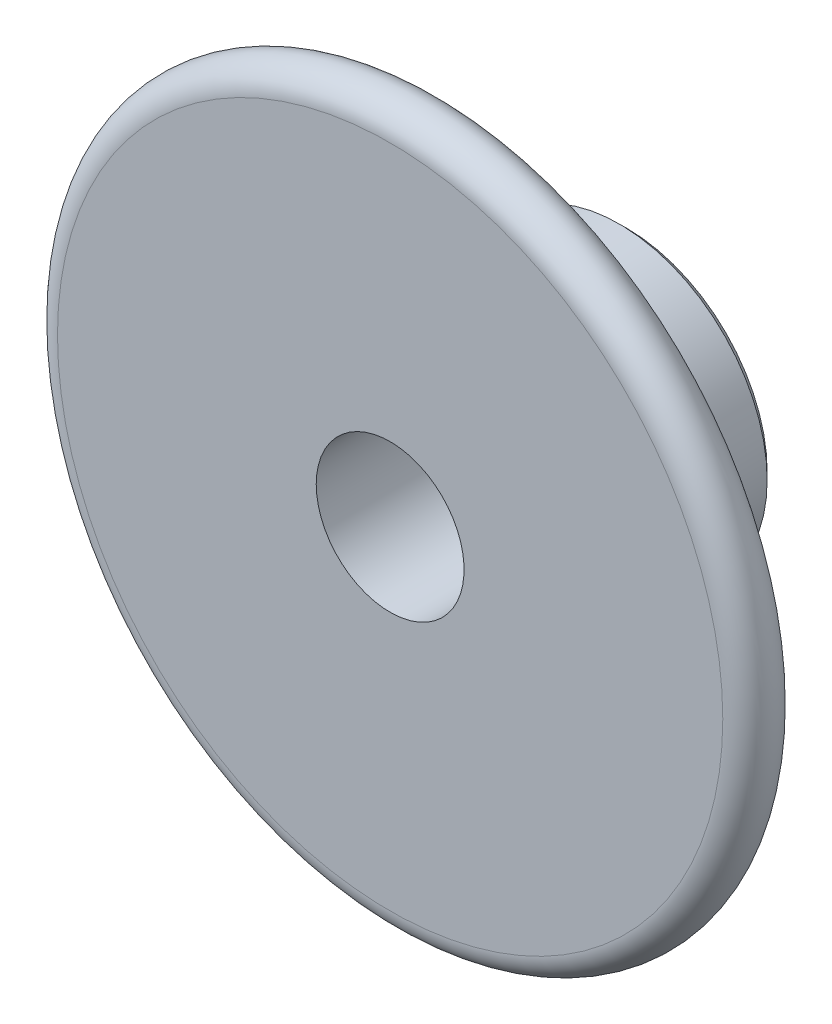
ISO-10303-21;
HEADER;
FILE_DESCRIPTION(('STEP AP214'),'2;1');
FILE_NAME('part.step','',(''),(''),'','','');
FILE_SCHEMA(('AUTOMOTIVE_DESIGN { 1 0 10303 214 1 1 1 1 }'));
ENDSEC;
DATA;
#1=APPLICATION_CONTEXT('core data for automotive mechanical design processes');
#2=APPLICATION_PROTOCOL_DEFINITION('international standard','automotive_design',2000,#1);
#3=PRODUCT_CONTEXT('',#1,'mechanical');
#4=PRODUCT('Part','Part','',(#3));
#5=PRODUCT_RELATED_PRODUCT_CATEGORY('part','',(#4));
#6=PRODUCT_DEFINITION_FORMATION('','',#4);
#7=PRODUCT_DEFINITION_CONTEXT('part definition',#1,'design');
#8=PRODUCT_DEFINITION('design','',#6,#7);
#9=PRODUCT_DEFINITION_SHAPE('','',#8);
#10=(LENGTH_UNIT() NAMED_UNIT(*) SI_UNIT(.MILLI.,.METRE.));
#11=(NAMED_UNIT(*) PLANE_ANGLE_UNIT() SI_UNIT($,.RADIAN.));
#12=(NAMED_UNIT(*) SI_UNIT($,.STERADIAN.) SOLID_ANGLE_UNIT());
#13=UNCERTAINTY_MEASURE_WITH_UNIT(LENGTH_MEASURE(1.E-05),#10,'distance_accuracy_value','');
#14=(GEOMETRIC_REPRESENTATION_CONTEXT(3) GLOBAL_UNCERTAINTY_ASSIGNED_CONTEXT((#13)) GLOBAL_UNIT_ASSIGNED_CONTEXT((#10,
#11,#12)) REPRESENTATION_CONTEXT('',''));
#15=CARTESIAN_POINT('',(0.,0.,0.));
#16=DIRECTION('',(0.,0.,1.));
#17=DIRECTION('',(1.,0.,0.));
#18=AXIS2_PLACEMENT_3D('',#15,#16,#17);
#19=CARTESIAN_POINT('',(0.,0.,12.5));
#20=DIRECTION('',(0.,0.,-1.));
#21=DIRECTION('',(-1.,0.,0.));
#22=AXIS2_PLACEMENT_3D('',#19,#20,#21);
#23=CYLINDRICAL_SURFACE('',#22,10.);
#24=CARTESIAN_POINT('',(10.,0.,7.64999999999999));
#25=CARTESIAN_POINT('',(9.99999843258099,0.092011453105751,7.64999629901469));
#26=CARTESIAN_POINT('',(9.99871684765511,0.184073454347172,7.64227754131457));
#27=CARTESIAN_POINT('',(9.99372775496381,0.365616322535328,7.61161876486206));
#28=CARTESIAN_POINT('',(9.9900180027216,0.455094721351767,7.58866466304119));
#29=CARTESIAN_POINT('',(9.98058875631552,0.628817487751612,7.52824636106408));
#30=CARTESIAN_POINT('',(9.974870893487,0.713066038744482,7.49079393643969));
#31=CARTESIAN_POINT('',(9.96205444853338,0.874072236504038,7.40247274585137));
#32=CARTESIAN_POINT('',(9.95495602786423,0.950830757653324,7.35160554849499));
#33=CARTESIAN_POINT('',(9.9400912001718,1.09540879372212,7.23739122286707));
#34=CARTESIAN_POINT('',(9.93231968689365,1.16314787882339,7.17394293638174));
#35=CARTESIAN_POINT('',(9.9170237472334,1.28706950777735,7.03658522640677));
#36=CARTESIAN_POINT('',(9.90949933632427,1.34325132909588,6.96267514935681));
#37=CARTESIAN_POINT('',(9.89550007731641,1.44278500045253,6.80594065632332));
#38=CARTESIAN_POINT('',(9.88903182722124,1.48605749570898,6.72306520565612));
#39=CARTESIAN_POINT('',(9.87794796970923,1.55803674048924,6.5510973747635));
#40=CARTESIAN_POINT('',(9.8733322397089,1.58674445381555,6.46200540635072));
#41=CARTESIAN_POINT('',(9.86652679242373,1.62852619503009,6.28098541799901));
#42=CARTESIAN_POINT('',(9.86431555933323,1.6417389592795,6.18909024432124));
#43=CARTESIAN_POINT('',(9.86250435770823,1.65258585530686,6.00436263407657));
#44=CARTESIAN_POINT('',(9.86290420804218,1.65022106770359,5.91153026296937));
#45=CARTESIAN_POINT('',(9.86625034802632,1.63009303176277,5.72855272294329));
#46=CARTESIAN_POINT('',(9.86917088684506,1.61248549472487,5.63838988597263));
#47=CARTESIAN_POINT('',(9.87718903199043,1.56261607367809,5.46231592946661));
#48=CARTESIAN_POINT('',(9.88228671162733,1.53035369619837,5.37640495321172));
#49=CARTESIAN_POINT('',(9.89411264039674,1.45193210975571,5.21080647007559));
#50=CARTESIAN_POINT('',(9.90084846298694,1.4057081060585,5.13115021075932));
#51=CARTESIAN_POINT('',(9.9151864393107,1.30072141548377,4.98066567609225));
#52=CARTESIAN_POINT('',(9.92278866158316,1.24195773629986,4.90983810008772));
#53=CARTESIAN_POINT('',(9.93811607123993,1.11271072676602,4.77812002111733));
#54=CARTESIAN_POINT('',(9.94584163094155,1.04209376928222,4.71736060537005));
#55=CARTESIAN_POINT('',(9.96045987838133,0.891597059898562,4.60853397839374));
#56=CARTESIAN_POINT('',(9.9673525609492,0.811717250503354,4.56046684595291));
#57=CARTESIAN_POINT('',(9.97953794169528,0.64484008317075,4.47837784946569));
#58=CARTESIAN_POINT('',(9.98482933722619,0.557837003156557,4.44436741236199));
#59=CARTESIAN_POINT('',(9.99320544362233,0.379246930002469,4.39147808722467));
#60=CARTESIAN_POINT('',(9.99629033536768,0.28766031326082,4.37259795885522));
#61=CARTESIAN_POINT('',(9.99988156603306,0.103632983819161,4.35068253883884));
#62=CARTESIAN_POINT('',(10.0004171933872,0.0112142564118358,4.34746726387847));
#63=CARTESIAN_POINT('',(9.99892971175882,-0.17284150555468,4.35649319868027));
#64=CARTESIAN_POINT('',(9.99690669920295,-0.264478569441162,4.36873382596048));
#65=CARTESIAN_POINT('',(9.99054737820398,-0.443814955541767,4.40817440277711));
#66=CARTESIAN_POINT('',(9.98622483070292,-0.531534371938299,4.43528539430836));
#67=CARTESIAN_POINT('',(9.97574921956607,-0.701182959294589,4.50360239255508));
#68=CARTESIAN_POINT('',(9.96959605484327,-0.783111810188986,4.54480917766169));
#69=CARTESIAN_POINT('',(9.95606928426946,-0.939636398877247,4.64056131949899));
#70=CARTESIAN_POINT('',(9.94868555427359,-1.01416235726447,4.6952192859171));
#71=CARTESIAN_POINT('',(9.93354765732487,-1.15304841333208,4.81616714906879));
#72=CARTESIAN_POINT('',(9.92579346406182,-1.21740778758215,4.8824578728543));
#73=CARTESIAN_POINT('',(9.91069407401676,-1.33479962911471,5.0255961063283));
#74=CARTESIAN_POINT('',(9.90335382329476,-1.38771058951943,5.10254387109881));
#75=CARTESIAN_POINT('',(9.89000528724129,-1.47985547415616,5.26434104706747));
#76=CARTESIAN_POINT('',(9.88399696030451,-1.51908982562646,5.34919021133191));
#77=CARTESIAN_POINT('',(9.87402953570153,-1.58258535747086,5.52403953240315));
#78=CARTESIAN_POINT('',(9.87006212213643,-1.60690737863648,5.61401709979667));
#79=CARTESIAN_POINT('',(9.86460473721113,-1.64007952798875,5.79685131178056));
#80=CARTESIAN_POINT('',(9.86311455516768,-1.64893097191818,5.88970771084816));
#81=CARTESIAN_POINT('',(9.86278931217107,-1.65087457438795,6.07445064130181));
#82=CARTESIAN_POINT('',(9.86392203182987,-1.64415796786953,6.16633516019211));
#83=CARTESIAN_POINT('',(9.86864441177183,-1.61556925478546,6.34764775186387));
#84=CARTESIAN_POINT('',(9.87223406454433,-1.59369719454886,6.43707583215359));
#85=CARTESIAN_POINT('',(9.88145370519206,-1.53549112071356,6.61086524243541));
#86=CARTESIAN_POINT('',(9.88708141498759,-1.49917324977365,6.69523210745096));
#87=CARTESIAN_POINT('',(9.89974533231771,-1.41312606218934,6.85670626686032));
#88=CARTESIAN_POINT('',(9.90678160742252,-1.3633961021142,6.93381321272772));
#89=CARTESIAN_POINT('',(9.92157214136343,-1.25125259966706,7.07954549763769));
#90=CARTESIAN_POINT('',(9.92933379899765,-1.18869826623126,7.14806175981956));
#91=CARTESIAN_POINT('',(9.94464125601211,-1.05297867490409,7.27369059987675));
#92=CARTESIAN_POINT('',(9.95218700513286,-0.979810970092667,7.33080054078023));
#93=CARTESIAN_POINT('',(9.96627143049842,-0.824354696103043,7.43234742257348));
#94=CARTESIAN_POINT('',(9.97280295936929,-0.742007852048184,7.47669614797802));
#95=CARTESIAN_POINT('',(9.98405342047581,-0.570959586923793,7.5508633528063));
#96=CARTESIAN_POINT('',(9.98877416450827,-0.482264623543762,7.58069636412524));
#97=CARTESIAN_POINT('',(9.99483601455804,-0.327682758240928,7.61847934152684));
#98=CARTESIAN_POINT('',(9.99676220083327,-0.2627330667111,7.63028074881449));
#99=CARTESIAN_POINT('',(9.99934474465587,-0.131864227625941,7.6460423389331));
#100=CARTESIAN_POINT('',(10.0000011233775,-0.0659450962546688,7.65000265251578));
#101=CARTESIAN_POINT('',(10.,0.,7.64999999999999));
#102=B_SPLINE_CURVE_WITH_KNOTS('',3,(#24,#25,#26,#27,#28,#29,#30,#31,#32,#33,#34,#35,#36,#37,
#38,#39,#40,#41,#42,#43,#44,#45,#46,#47,#48,#49,#50,#51,#52,#53,#54,#55,#56,#57,#58,#59,#60,#61,
#62,#63,#64,#65,#66,#67,#68,#69,#70,#71,#72,#73,#74,#75,#76,#77,#78,#79,#80,#81,#82,#83,#84,#85,
#86,#87,#88,#89,#90,#91,#92,#93,#94,#95,#96,#97,#98,#99,#100,#101),.UNSPECIFIED.,.T.,.F.,(4,2,2,
2,2,2,2,2,2,2,2,2,2,2,2,2,2,2,2,2,2,2,2,2,2,2,2,2,2,2,2,2,2,2,2,2,2,2,4),(0.,0.275793319008917,
0.551841928312971,0.827666799870595,1.1034594331417,1.38156673144315,1.65969141110741,
1.93949209608633,2.21927426326044,2.49653175525205,2.77377001402269,3.04820914252876,
3.32265751287871,3.59839967320041,3.87416366201706,4.1532757240192,4.43238951858747,
4.71172976565331,4.991047110928,5.26714751096616,5.54323750600188,5.81769359979003,
6.09216485190802,6.36901711215384,6.64588906369256,6.92556925596458,7.20524071063226,
7.48376340648031,7.76226241335695,8.03735855216243,8.312453850024,8.58724259883657,
8.86204453269315,9.14004258759616,9.4181048373113,9.69804546871316,9.97770526783279,
10.1753710978727,10.3730336317698),.UNSPECIFIED.);
#103=CARTESIAN_POINT('',(10.,0.,7.64999999999999));
#104=VERTEX_POINT('',#103);
#105=EDGE_CURVE('E96',#104,#104,#102,.T.);
#106=ORIENTED_EDGE('',*,*,#105,.T.);
#107=EDGE_LOOP('',(#106));
#108=FACE_BOUND('',#107,.T.);
#109=CARTESIAN_POINT('',(0.,0.,0.499999999999994));
#110=DIRECTION('',(0.,0.,1.));
#111=DIRECTION('',(1.,0.,0.));
#112=AXIS2_PLACEMENT_3D('',#109,#110,#111);
#113=CIRCLE('',#112,10.);
#114=CARTESIAN_POINT('',(10.,0.,0.499999999999994));
#115=VERTEX_POINT('',#114);
#116=EDGE_CURVE('E10',#115,#115,#113,.T.);
#117=ORIENTED_EDGE('',*,*,#116,.T.);
#118=EDGE_LOOP('',(#117));
#119=FACE_BOUND('',#118,.T.);
#120=CARTESIAN_POINT('',(0.,10.,4.35000000000001));
#121=CARTESIAN_POINT('',(0.0920114531057511,9.99999843258099,4.35000370098531));
#122=CARTESIAN_POINT('',(0.184073454347172,9.99871684765511,4.35772245868543));
#123=CARTESIAN_POINT('',(0.365616322535328,9.99372775496381,4.38838123513794));
#124=CARTESIAN_POINT('',(0.455094721351767,9.9900180027216,4.41133533695881));
#125=CARTESIAN_POINT('',(0.628817487751613,9.98058875631552,4.47175363893592));
#126=CARTESIAN_POINT('',(0.713066038744483,9.974870893487,4.50920606356031));
#127=CARTESIAN_POINT('',(0.874072236504039,9.96205444853338,4.59752725414863));
#128=CARTESIAN_POINT('',(0.950830757653325,9.95495602786423,4.64839445150501));
#129=CARTESIAN_POINT('',(1.09540879372212,9.9400912001718,4.76260877713293));
#130=CARTESIAN_POINT('',(1.16314787882339,9.93231968689365,4.82605706361826));
#131=CARTESIAN_POINT('',(1.28706950777735,9.9170237472334,4.96341477359323));
#132=CARTESIAN_POINT('',(1.34325132909588,9.90949933632427,5.03732485064319));
#133=CARTESIAN_POINT('',(1.44278500045253,9.89550007731641,5.19405934367668));
#134=CARTESIAN_POINT('',(1.48605749570898,9.88903182722124,5.27693479434388));
#135=CARTESIAN_POINT('',(1.55803674048924,9.87794796970923,5.4489026252365));
#136=CARTESIAN_POINT('',(1.58674445381555,9.8733322397089,5.53799459364928));
#137=CARTESIAN_POINT('',(1.62852619503009,9.86652679242373,5.71901458200099));
#138=CARTESIAN_POINT('',(1.6417389592795,9.86431555933323,5.81090975567876));
#139=CARTESIAN_POINT('',(1.65258585530686,9.86250435770823,5.99563736592343));
#140=CARTESIAN_POINT('',(1.65022106770359,9.86290420804218,6.08846973703063));
#141=CARTESIAN_POINT('',(1.63009303176277,9.86625034802632,6.27144727705671));
#142=CARTESIAN_POINT('',(1.61248549472487,9.86917088684506,6.36161011402737));
#143=CARTESIAN_POINT('',(1.56261607367809,9.87718903199043,6.5376840705334));
#144=CARTESIAN_POINT('',(1.53035369619837,9.88228671162733,6.62359504678828));
#145=CARTESIAN_POINT('',(1.45193210975571,9.89411264039674,6.78919352992442));
#146=CARTESIAN_POINT('',(1.40570810605849,9.90084846298694,6.86884978924068));
#147=CARTESIAN_POINT('',(1.30072141548377,9.9151864393107,7.01933432390775));
#148=CARTESIAN_POINT('',(1.24195773629986,9.92278866158316,7.09016189991229));
#149=CARTESIAN_POINT('',(1.11271072676602,9.93811607123993,7.22187997888267));
#150=CARTESIAN_POINT('',(1.04209376928222,9.94584163094155,7.28263939462995));
#151=CARTESIAN_POINT('',(0.891597059898561,9.96045987838133,7.39146602160626));
#152=CARTESIAN_POINT('',(0.811717250503353,9.9673525609492,7.43953315404709));
#153=CARTESIAN_POINT('',(0.64484008317075,9.97953794169528,7.52162215053431));
#154=CARTESIAN_POINT('',(0.557837003156556,9.98482933722619,7.55563258763801));
#155=CARTESIAN_POINT('',(0.379246930002468,9.99320544362233,7.60852191277533));
#156=CARTESIAN_POINT('',(0.28766031326082,9.99629033536768,7.62740204114478));
#157=CARTESIAN_POINT('',(0.10363298381916,9.99988156603306,7.64931746116117));
#158=CARTESIAN_POINT('',(0.0112142564118353,10.0004171933872,7.65253273612153));
#159=CARTESIAN_POINT('',(-0.172841505554681,9.99892971175882,7.64350680131973));
#160=CARTESIAN_POINT('',(-0.264478569441163,9.99690669920295,7.63126617403952));
#161=CARTESIAN_POINT('',(-0.443814955541768,9.99054737820398,7.59182559722289));
#162=CARTESIAN_POINT('',(-0.5315343719383,9.98622483070291,7.56471460569164));
#163=CARTESIAN_POINT('',(-0.70118295929459,9.97574921956607,7.49639760744492));
#164=CARTESIAN_POINT('',(-0.783111810188987,9.96959605484327,7.45519082233831));
#165=CARTESIAN_POINT('',(-0.939636398877248,9.95606928426946,7.35943868050101));
#166=CARTESIAN_POINT('',(-1.01416235726447,9.94868555427359,7.3047807140829));
#167=CARTESIAN_POINT('',(-1.15304841333208,9.93354765732487,7.18383285093121));
#168=CARTESIAN_POINT('',(-1.21740778758215,9.92579346406183,7.1175421271457));
#169=CARTESIAN_POINT('',(-1.33479962911471,9.91069407401676,6.9744038936717));
#170=CARTESIAN_POINT('',(-1.38771058951943,9.90335382329476,6.89745612890119));
#171=CARTESIAN_POINT('',(-1.47985547415616,9.89000528724129,6.73565895293253));
#172=CARTESIAN_POINT('',(-1.51908982562647,9.88399696030451,6.65080978866809));
#173=CARTESIAN_POINT('',(-1.58258535747086,9.87402953570153,6.47596046759685));
#174=CARTESIAN_POINT('',(-1.60690737863648,9.87006212213643,6.38598290020333));
#175=CARTESIAN_POINT('',(-1.64007952798875,9.86460473721113,6.20314868821944));
#176=CARTESIAN_POINT('',(-1.64893097191818,9.86311455516768,6.11029228915184));
#177=CARTESIAN_POINT('',(-1.65087457438795,9.86278931217107,5.92554935869819));
#178=CARTESIAN_POINT('',(-1.64415796786953,9.86392203182987,5.83366483980789));
#179=CARTESIAN_POINT('',(-1.61556925478546,9.86864441177183,5.65235224813613));
#180=CARTESIAN_POINT('',(-1.59369719454886,9.87223406454433,5.56292416784641));
#181=CARTESIAN_POINT('',(-1.53549112071356,9.88145370519206,5.38913475756459));
#182=CARTESIAN_POINT('',(-1.49917324977365,9.88708141498759,5.30476789254904));
#183=CARTESIAN_POINT('',(-1.41312606218934,9.89974533231771,5.14329373313968));
#184=CARTESIAN_POINT('',(-1.3633961021142,9.90678160742253,5.06618678727228));
#185=CARTESIAN_POINT('',(-1.25125259966706,9.92157214136343,4.92045450236232));
#186=CARTESIAN_POINT('',(-1.18869826623126,9.92933379899765,4.85193824018044));
#187=CARTESIAN_POINT('',(-1.05297867490409,9.94464125601211,4.72630940012325));
#188=CARTESIAN_POINT('',(-0.979810970092667,9.95218700513286,4.66919945921977));
#189=CARTESIAN_POINT('',(-0.824354696103043,9.96627143049842,4.56765257742652));
#190=CARTESIAN_POINT('',(-0.742007852048184,9.97280295936929,4.52330385202198));
#191=CARTESIAN_POINT('',(-0.570959586923793,9.98405342047581,4.4491366471937));
#192=CARTESIAN_POINT('',(-0.482264623543762,9.98877416450827,4.41930363587476));
#193=CARTESIAN_POINT('',(-0.327682758240928,9.99483601455804,4.38152065847316));
#194=CARTESIAN_POINT('',(-0.2627330667111,9.99676220083327,4.36971925118551));
#195=CARTESIAN_POINT('',(-0.131864227625941,9.99934474465587,4.3539576610669));
#196=CARTESIAN_POINT('',(-0.065945096254669,10.0000011233775,4.34999734748422));
#197=CARTESIAN_POINT('',(0.,10.,4.35000000000001));
#198=B_SPLINE_CURVE_WITH_KNOTS('',3,(#120,#121,#122,#123,#124,#125,#126,#127,#128,#129,#130,
#131,#132,#133,#134,#135,#136,#137,#138,#139,#140,#141,#142,#143,#144,#145,#146,#147,#148,#149,
#150,#151,#152,#153,#154,#155,#156,#157,#158,#159,#160,#161,#162,#163,#164,#165,#166,#167,#168,
#169,#170,#171,#172,#173,#174,#175,#176,#177,#178,#179,#180,#181,#182,#183,#184,#185,#186,#187,
#188,#189,#190,#191,#192,#193,#194,#195,#196,#197),.UNSPECIFIED.,.T.,.F.,(4,2,2,2,2,2,2,2,2,2,2,
2,2,2,2,2,2,2,2,2,2,2,2,2,2,2,2,2,2,2,2,2,2,2,2,2,2,2,4),(0.,0.275793319008918,
0.551841928312971,0.827666799870596,1.1034594331417,1.38156673144315,1.65969141110741,
1.93949209608633,2.21927426326044,2.49653175525206,2.77377001402269,3.04820914252876,
3.32265751287871,3.59839967320041,3.87416366201706,4.1532757240192,4.43238951858747,
4.71172976565331,4.991047110928,5.26714751096616,5.54323750600189,5.81769359979003,
6.09216485190802,6.36901711215385,6.64588906369256,6.92556925596458,7.20524071063227,
7.48376340648032,7.76226241335695,8.03735855216243,8.31245385002401,8.58724259883657,
8.86204453269315,9.14004258759615,9.4181048373113,9.69804546871316,9.97770526783279,
10.1753710978727,10.3730336317698),.UNSPECIFIED.);
#199=CARTESIAN_POINT('',(0.,10.,4.35000000000001));
#200=VERTEX_POINT('',#199);
#201=EDGE_CURVE('E65',#200,#200,#198,.T.);
#202=ORIENTED_EDGE('',*,*,#201,.T.);
#203=EDGE_LOOP('',(#202));
#204=FACE_BOUND('',#203,.T.);
#205=CARTESIAN_POINT('',(0.,0.,12.5));
#206=DIRECTION('',(0.,0.,1.));
#207=DIRECTION('',(1.,0.,0.));
#208=AXIS2_PLACEMENT_3D('',#205,#206,#207);
#209=CIRCLE('',#208,10.);
#210=CARTESIAN_POINT('',(10.,0.,12.5));
#211=VERTEX_POINT('',#210);
#212=EDGE_CURVE('E57',#211,#211,#209,.T.);
#213=ORIENTED_EDGE('',*,*,#212,.F.);
#214=EDGE_LOOP('',(#213));
#215=FACE_BOUND('',#214,.T.);
#216=ADVANCED_FACE('F32',(#108,#119,#204,#215),#23,.T.);
#217=CARTESIAN_POINT('',(0.,0.,0.));
#218=DIRECTION('',(0.,0.,1.));
#219=DIRECTION('',(1.,0.,0.));
#220=AXIS2_PLACEMENT_3D('',#217,#218,#219);
#221=PLANE('',#220);
#222=CARTESIAN_POINT('',(0.,0.,0.));
#223=DIRECTION('',(0.,0.,1.));
#224=DIRECTION('',(1.,0.,0.));
#225=AXIS2_PLACEMENT_3D('',#222,#223,#224);
#226=CIRCLE('',#225,5.5);
#227=CARTESIAN_POINT('',(5.5,0.,0.));
#228=VERTEX_POINT('',#227);
#229=EDGE_CURVE('E45',#228,#228,#226,.T.);
#230=ORIENTED_EDGE('',*,*,#229,.T.);
#231=EDGE_LOOP('',(#230));
#232=FACE_BOUND('',#231,.T.);
#233=CARTESIAN_POINT('',(0.,0.,0.));
#234=DIRECTION('',(0.,0.,1.));
#235=DIRECTION('',(1.,0.,0.));
#236=AXIS2_PLACEMENT_3D('',#233,#234,#235);
#237=CIRCLE('',#236,9.50000000000001);
#238=CARTESIAN_POINT('',(9.50000000000001,0.,0.));
#239=VERTEX_POINT('',#238);
#240=EDGE_CURVE('E49',#239,#239,#237,.F.);
#241=ORIENTED_EDGE('',*,*,#240,.T.);
#242=EDGE_LOOP('',(#241));
#243=FACE_BOUND('',#242,.T.);
#244=ADVANCED_FACE('F92',(#232,#243),#221,.F.);
#245=CARTESIAN_POINT('',(0.,0.,12.5));
#246=DIRECTION('',(0.,0.,1.));
#247=DIRECTION('',(1.,0.,0.));
#248=AXIS2_PLACEMENT_3D('',#245,#246,#247);
#249=PLANE('',#248);
#250=CARTESIAN_POINT('',(0.,0.,12.5));
#251=DIRECTION('',(0.,0.,1.));
#252=DIRECTION('',(1.,0.,0.));
#253=AXIS2_PLACEMENT_3D('',#250,#251,#252);
#254=CIRCLE('',#253,22.5);
#255=CARTESIAN_POINT('',(22.5,0.,12.5));
#256=VERTEX_POINT('',#255);
#257=EDGE_CURVE('E120',#256,#256,#254,.T.);
#258=ORIENTED_EDGE('',*,*,#257,.F.);
#259=EDGE_LOOP('',(#258));
#260=FACE_BOUND('',#259,.T.);
#261=ORIENTED_EDGE('',*,*,#212,.T.);
#262=EDGE_LOOP('',(#261));
#263=FACE_BOUND('',#262,.T.);
#264=ADVANCED_FACE('F135',(#260,#263),#249,.F.);
#265=CARTESIAN_POINT('',(0.,0.,16.));
#266=DIRECTION('',(0.,0.,1.));
#267=DIRECTION('',(1.,0.,0.));
#268=AXIS2_PLACEMENT_3D('',#265,#266,#267);
#269=PLANE('',#268);
#270=CARTESIAN_POINT('',(0.,0.,16.));
#271=DIRECTION('',(0.,0.,-1.));
#272=DIRECTION('',(-1.,0.,0.));
#273=AXIS2_PLACEMENT_3D('',#270,#271,#272);
#274=CIRCLE('',#273,5.);
#275=CARTESIAN_POINT('',(-5.,0.,16.));
#276=VERTEX_POINT('',#275);
#277=EDGE_CURVE('E87',#276,#276,#274,.T.);
#278=ORIENTED_EDGE('',*,*,#277,.T.);
#279=EDGE_LOOP('',(#278));
#280=FACE_BOUND('',#279,.T.);
#281=CARTESIAN_POINT('',(0.,0.,16.));
#282=DIRECTION('',(0.,0.,1.));
#283=DIRECTION('',(1.,0.,0.));
#284=AXIS2_PLACEMENT_3D('',#281,#282,#283);
#285=CIRCLE('',#284,22.5);
#286=CARTESIAN_POINT('',(22.5,0.,16.));
#287=VERTEX_POINT('',#286);
#288=EDGE_CURVE('E66',#287,#287,#285,.F.);
#289=ORIENTED_EDGE('',*,*,#288,.F.);
#290=EDGE_LOOP('',(#289));
#291=FACE_BOUND('',#290,.T.);
#292=ADVANCED_FACE('F127',(#280,#291),#269,.T.);
#293=CARTESIAN_POINT('',(0.,0.,16.));
#294=DIRECTION('',(0.,0.,-1.));
#295=DIRECTION('',(-1.,0.,0.));
#296=AXIS2_PLACEMENT_3D('',#293,#294,#295);
#297=CYLINDRICAL_SURFACE('',#296,5.);
#298=CARTESIAN_POINT('',(5.,0.,7.64999999999999));
#299=CARTESIAN_POINT('',(5.00000012564882,-0.0900803323989865,7.65000024251438));
#300=CARTESIAN_POINT('',(4.99754312617873,-0.180159574077353,7.64259916251504));
#301=CARTESIAN_POINT('',(4.98798348171152,-0.357667875169256,7.61327885047236));
#302=CARTESIAN_POINT('',(4.98088026257134,-0.445096605656319,7.59135782416471));
#303=CARTESIAN_POINT('',(4.962800681432,-0.614719075952391,7.53382868761171));
#304=CARTESIAN_POINT('',(4.95183071876683,-0.696921201899963,7.49824318298596));
#305=CARTESIAN_POINT('',(4.92713947248839,-0.85419064587448,7.41449642730815));
#306=CARTESIAN_POINT('',(4.91341766335966,-0.92925659707605,7.36633277369657));
#307=CARTESIAN_POINT('',(4.88414667976015,-1.07267700256013,7.25707517692859));
#308=CARTESIAN_POINT('',(4.86855436886587,-1.140755021368,7.19562998172584));
#309=CARTESIAN_POINT('',(4.83753907804007,-1.26585047260416,7.06230048608016));
#310=CARTESIAN_POINT('',(4.8221161350793,-1.32286553369749,6.99041395330728));
#311=CARTESIAN_POINT('',(4.79271313173334,-1.42578155512387,6.83576938762055));
#312=CARTESIAN_POINT('',(4.77878574898835,-1.47132547146369,6.75276276241483));
#313=CARTESIAN_POINT('',(4.75460549483772,-1.5476895000705,6.57973436916592));
#314=CARTESIAN_POINT('',(4.74435152777497,-1.57851400356115,6.48971470264767));
#315=CARTESIAN_POINT('',(4.72913282635101,-1.62353134991423,6.30835517091874));
#316=CARTESIAN_POINT('',(4.72400412235767,-1.63824134173319,6.21715783667435));
#317=CARTESIAN_POINT('',(4.7191313464795,-1.65222861163855,6.03345638730599));
#318=CARTESIAN_POINT('',(4.71938564975367,-1.65151054662634,5.94095267493226));
#319=CARTESIAN_POINT('',(4.72510629107568,-1.63506410098718,5.76165279760769));
#320=CARTESIAN_POINT('',(4.73033928879681,-1.62000769651632,5.67478626476119));
#321=CARTESIAN_POINT('',(4.74504632523488,-1.57640708934976,5.50488909383328));
#322=CARTESIAN_POINT('',(4.75452086227438,-1.54786130181505,5.42185890773475));
#323=CARTESIAN_POINT('',(4.77681173941,-1.47764674240872,5.26045256000537));
#324=CARTESIAN_POINT('',(4.78967871947683,-1.43577693123635,5.18217114977468));
#325=CARTESIAN_POINT('',(4.81728315916032,-1.34024242388314,5.03353163769848));
#326=CARTESIAN_POINT('',(4.8320211498719,-1.28657437554157,4.96317579630595));
#327=CARTESIAN_POINT('',(4.86262798242566,-1.16572801734404,4.82860477258979));
#328=CARTESIAN_POINT('',(4.87851612594017,-1.09799945388895,4.76488712135686));
#329=CARTESIAN_POINT('',(4.9089733458653,-0.952622363558084,4.64958582176081));
#330=CARTESIAN_POINT('',(4.92354230068063,-0.874972923819717,4.59800329124502));
#331=CARTESIAN_POINT('',(4.94990429259939,-0.710918878360193,4.50804648316299));
#332=CARTESIAN_POINT('',(4.96166947936115,-0.624437715003006,4.46980310278696));
#333=CARTESIAN_POINT('',(4.98089634514734,-0.445788820584335,4.40856028039371));
#334=CARTESIAN_POINT('',(4.98835948795835,-0.353623035566633,4.38555565293588));
#335=CARTESIAN_POINT('',(4.99790001929539,-0.170434936942809,4.35631921461675));
#336=CARTESIAN_POINT('',(5.00019320840939,-0.0795310449403313,4.34941490636055));
#337=CARTESIAN_POINT('',(4.99978120399321,0.10215299707419,4.35066263269127));
#338=CARTESIAN_POINT('',(4.99707683523427,0.192933165030689,4.35881218286677));
#339=CARTESIAN_POINT('',(4.98711592890817,0.369117276094975,4.38940282618292));
#340=CARTESIAN_POINT('',(4.97999029806495,0.454600657078432,4.41143321001454));
#341=CARTESIAN_POINT('',(4.9620361021664,0.620625393385986,4.46864869151176));
#342=CARTESIAN_POINT('',(4.9512070668376,0.70116611953883,4.5038354598819));
#343=CARTESIAN_POINT('',(4.92659738190256,0.857353583850653,4.58738101955237));
#344=CARTESIAN_POINT('',(4.91274728599484,0.932818538636806,4.6360586147645));
#345=CARTESIAN_POINT('',(4.8836680633903,1.07472879779132,4.74482823479592));
#346=CARTESIAN_POINT('',(4.86843852373584,1.14117138619964,4.80492368367397));
#347=CARTESIAN_POINT('',(4.83745909847491,1.26622547851876,4.93798617269196));
#348=CARTESIAN_POINT('',(4.82171620160002,1.32435715949936,5.0114068669237));
#349=CARTESIAN_POINT('',(4.79218567046633,1.42753142742357,5.16729985489369));
#350=CARTESIAN_POINT('',(4.77839804366632,1.47257396443645,5.24977218315924));
#351=CARTESIAN_POINT('',(4.75447746870333,1.54806908435207,5.42142548395833));
#352=CARTESIAN_POINT('',(4.74433588191365,1.57855621066784,5.51058998597722));
#353=CARTESIAN_POINT('',(4.728992662468,1.62395003915295,5.6931979020796));
#354=CARTESIAN_POINT('',(4.72378886275909,1.63886357641239,5.78663942021203));
#355=CARTESIAN_POINT('',(4.71915352744858,1.65216049477083,5.97008542491291));
#356=CARTESIAN_POINT('',(4.71944442417867,1.6513387236508,6.06002593637817));
#357=CARTESIAN_POINT('',(4.72508139490563,1.63513842564513,6.23841659959015));
#358=CARTESIAN_POINT('',(4.7304271793221,1.61976073262755,6.32686683641512));
#359=CARTESIAN_POINT('',(4.74536693764462,1.57544291875231,6.49816413718459));
#360=CARTESIAN_POINT('',(4.75488165289364,1.54675527092969,6.58108397215747));
#361=CARTESIAN_POINT('',(4.77705935615133,1.47683540940045,6.74099749266257));
#362=CARTESIAN_POINT('',(4.78972303393434,1.43560044678476,6.8179898749519));
#363=CARTESIAN_POINT('',(4.81744939348764,1.33969084183065,6.96744345436638));
#364=CARTESIAN_POINT('',(4.83259170443489,1.28451538865981,7.03956841106976));
#365=CARTESIAN_POINT('',(4.86323043063064,1.16314331347536,7.17379258067501));
#366=CARTESIAN_POINT('',(4.87872694403302,1.09694360376002,7.23588897512673));
#367=CARTESIAN_POINT('',(4.90903317548774,0.952387676734104,7.35066333180925));
#368=CARTESIAN_POINT('',(4.92379458911327,0.873665758138167,7.40289502168524));
#369=CARTESIAN_POINT('',(4.95031750248797,0.708077082051266,7.49332485789775));
#370=CARTESIAN_POINT('',(4.96207983840249,0.621212604024477,7.53152691711137));
#371=CARTESIAN_POINT('',(4.98076953032462,0.44638654187221,7.59101301503052));
#372=CARTESIAN_POINT('',(4.98791371763214,0.35870915508395,7.61306352248398));
#373=CARTESIAN_POINT('',(4.99752827480817,0.180687007883426,7.64255497204319));
#374=CARTESIAN_POINT('',(4.99999987398486,0.0903429553968467,7.64999975677856));
#375=CARTESIAN_POINT('',(5.,0.,7.64999999999999));
#376=B_SPLINE_CURVE_WITH_KNOTS('',3,(#298,#299,#300,#301,#302,#303,#304,#305,#306,#307,#308,
#309,#310,#311,#312,#313,#314,#315,#316,#317,#318,#319,#320,#321,#322,#323,#324,#325,#326,#327,
#328,#329,#330,#331,#332,#333,#334,#335,#336,#337,#338,#339,#340,#341,#342,#343,#344,#345,#346,
#347,#348,#349,#350,#351,#352,#353,#354,#355,#356,#357,#358,#359,#360,#361,#362,#363,#364,#365,
#366,#367,#368,#369,#370,#371,#372,#373,#374,#375),.UNSPECIFIED.,.T.,.F.,(4,2,2,2,2,2,2,2,2,2,2,
2,2,2,2,2,2,2,2,2,2,2,2,2,2,2,2,2,2,2,2,2,2,2,2,2,2,2,4),(0.,0.269908604132499,
0.539850567737244,0.80934786768909,1.07889668217443,1.3567121576595,1.63458711701567,
1.92026489148116,2.20585738673401,2.48198869358465,2.75803665240172,3.02175295330502,
3.28550024538371,3.55343249441285,3.82144096800202,4.10314526837293,4.38487550826384,
4.66929734218006,4.95362234329172,5.22584041060144,5.4980135564539,5.76248915124944,
6.02699834271652,6.29838751507402,6.56985820217365,6.8534047271815,7.13695233381082,
7.41982362841782,7.70257072144067,7.97107468624605,8.23956327014091,8.50315503612406,
8.76680459233087,9.04176838412558,9.31680931840233,9.60227659952693,9.8876642029874,
10.1584309528124,10.4291264568694),.UNSPECIFIED.);
#377=CARTESIAN_POINT('',(5.,0.,7.64999999999999));
#378=VERTEX_POINT('',#377);
#379=EDGE_CURVE('E36',#378,#378,#376,.T.);
#380=ORIENTED_EDGE('',*,*,#379,.T.);
#381=EDGE_LOOP('',(#380));
#382=FACE_BOUND('',#381,.T.);
#383=CARTESIAN_POINT('',(0.,0.,0.5));
#384=DIRECTION('',(0.,0.,1.));
#385=DIRECTION('',(1.,0.,0.));
#386=AXIS2_PLACEMENT_3D('',#383,#384,#385);
#387=CIRCLE('',#386,5.);
#388=CARTESIAN_POINT('',(5.,0.,0.5));
#389=VERTEX_POINT('',#388);
#390=EDGE_CURVE('E54',#389,#389,#387,.F.);
#391=ORIENTED_EDGE('',*,*,#390,.T.);
#392=EDGE_LOOP('',(#391));
#393=FACE_BOUND('',#392,.T.);
#394=CARTESIAN_POINT('',(0.,5.,4.35000000000001));
#395=CARTESIAN_POINT('',(-0.0900803323989866,5.00000012564882,4.34999975748561));
#396=CARTESIAN_POINT('',(-0.180159574077353,4.99754312617873,4.35740083748496));
#397=CARTESIAN_POINT('',(-0.357667875169256,4.98798348171152,4.38672114952764));
#398=CARTESIAN_POINT('',(-0.445096605656319,4.98088026257134,4.40864217583529));
#399=CARTESIAN_POINT('',(-0.614719075952392,4.962800681432,4.46617131238829));
#400=CARTESIAN_POINT('',(-0.696921201899963,4.95183071876683,4.50175681701404));
#401=CARTESIAN_POINT('',(-0.85419064587448,4.92713947248839,4.58550357269186));
#402=CARTESIAN_POINT('',(-0.92925659707605,4.91341766335966,4.63366722630343));
#403=CARTESIAN_POINT('',(-1.07267700256013,4.88414667976015,4.74292482307141));
#404=CARTESIAN_POINT('',(-1.140755021368,4.86855436886587,4.80437001827416));
#405=CARTESIAN_POINT('',(-1.26585047260416,4.83753907804007,4.93769951391984));
#406=CARTESIAN_POINT('',(-1.32286553369749,4.8221161350793,5.00958604669272));
#407=CARTESIAN_POINT('',(-1.42578155512387,4.79271313173334,5.16423061237945));
#408=CARTESIAN_POINT('',(-1.47132547146369,4.77878574898835,5.24723723758517));
#409=CARTESIAN_POINT('',(-1.5476895000705,4.75460549483772,5.42026563083408));
#410=CARTESIAN_POINT('',(-1.57851400356115,4.74435152777497,5.51028529735233));
#411=CARTESIAN_POINT('',(-1.62353134991423,4.72913282635101,5.69164482908126));
#412=CARTESIAN_POINT('',(-1.63824134173319,4.72400412235767,5.78284216332565));
#413=CARTESIAN_POINT('',(-1.65222861163855,4.7191313464795,5.96654361269401));
#414=CARTESIAN_POINT('',(-1.65151054662634,4.71938564975367,6.05904732506774));
#415=CARTESIAN_POINT('',(-1.63506410098718,4.72510629107568,6.23834720239231));
#416=CARTESIAN_POINT('',(-1.62000769651632,4.73033928879682,6.32521373523881));
#417=CARTESIAN_POINT('',(-1.57640708934976,4.74504632523488,6.49511090616673));
#418=CARTESIAN_POINT('',(-1.54786130181505,4.75452086227438,6.57814109226526));
#419=CARTESIAN_POINT('',(-1.47764674240872,4.77681173941,6.73954743999463));
#420=CARTESIAN_POINT('',(-1.43577693123635,4.78967871947683,6.81782885022532));
#421=CARTESIAN_POINT('',(-1.34024242388314,4.81728315916032,6.96646836230152));
#422=CARTESIAN_POINT('',(-1.28657437554157,4.8320211498719,7.03682420369405));
#423=CARTESIAN_POINT('',(-1.16572801734403,4.86262798242566,7.17139522741021));
#424=CARTESIAN_POINT('',(-1.09799945388895,4.87851612594017,7.23511287864314));
#425=CARTESIAN_POINT('',(-0.952622363558083,4.9089733458653,7.35041417823919));
#426=CARTESIAN_POINT('',(-0.874972923819715,4.92354230068063,7.40199670875498));
#427=CARTESIAN_POINT('',(-0.710918878360191,4.94990429259939,7.49195351683701));
#428=CARTESIAN_POINT('',(-0.624437715003004,4.96166947936115,7.53019689721304));
#429=CARTESIAN_POINT('',(-0.445788820584333,4.98089634514734,7.59143971960629));
#430=CARTESIAN_POINT('',(-0.353623035566632,4.98835948795835,7.61444434706412));
#431=CARTESIAN_POINT('',(-0.170434936942807,4.99790001929539,7.64368078538325));
#432=CARTESIAN_POINT('',(-0.0795310449403294,5.00019320840939,7.65058509363945));
#433=CARTESIAN_POINT('',(0.102152997074192,4.99978120399321,7.64933736730873));
#434=CARTESIAN_POINT('',(0.192933165030691,4.99707683523427,7.64118781713324));
#435=CARTESIAN_POINT('',(0.369117276094977,4.98711592890817,7.61059717381709));
#436=CARTESIAN_POINT('',(0.454600657078434,4.97999029806495,7.58856678998546));
#437=CARTESIAN_POINT('',(0.620625393385987,4.9620361021664,7.53135130848824));
#438=CARTESIAN_POINT('',(0.701166119538832,4.9512070668376,7.4961645401181));
#439=CARTESIAN_POINT('',(0.857353583850654,4.92659738190256,7.41261898044763));
#440=CARTESIAN_POINT('',(0.932818538636807,4.91274728599484,7.3639413852355));
#441=CARTESIAN_POINT('',(1.07472879779132,4.8836680633903,7.25517176520408));
#442=CARTESIAN_POINT('',(1.14117138619964,4.86843852373584,7.19507631632603));
#443=CARTESIAN_POINT('',(1.26622547851876,4.83745909847491,7.06201382730804));
#444=CARTESIAN_POINT('',(1.32435715949936,4.82171620160002,6.98859313307629));
#445=CARTESIAN_POINT('',(1.42753142742357,4.79218567046633,6.83270014510631));
#446=CARTESIAN_POINT('',(1.47257396443646,4.77839804366632,6.75022781684076));
#447=CARTESIAN_POINT('',(1.54806908435207,4.75447746870333,6.57857451604166));
#448=CARTESIAN_POINT('',(1.57855621066784,4.74433588191365,6.48941001402278));
#449=CARTESIAN_POINT('',(1.62395003915295,4.728992662468,6.3068020979204));
#450=CARTESIAN_POINT('',(1.63886357641239,4.72378886275909,6.21336057978797));
#451=CARTESIAN_POINT('',(1.65216049477083,4.71915352744858,6.02991457508709));
#452=CARTESIAN_POINT('',(1.6513387236508,4.71944442417867,5.93997406362183));
#453=CARTESIAN_POINT('',(1.63513842564513,4.72508139490563,5.76158340040985));
#454=CARTESIAN_POINT('',(1.61976073262755,4.7304271793221,5.67313316358488));
#455=CARTESIAN_POINT('',(1.57544291875231,4.74536693764462,5.50183586281541));
#456=CARTESIAN_POINT('',(1.54675527092969,4.75488165289364,5.41891602784253));
#457=CARTESIAN_POINT('',(1.47683540940045,4.77705935615133,5.25900250733743));
#458=CARTESIAN_POINT('',(1.43560044678476,4.78972303393434,5.1820101250481));
#459=CARTESIAN_POINT('',(1.33969084183065,4.81744939348764,5.03255654563362));
#460=CARTESIAN_POINT('',(1.28451538865981,4.83259170443489,4.96043158893023));
#461=CARTESIAN_POINT('',(1.16314331347536,4.86323043063064,4.82620741932499));
#462=CARTESIAN_POINT('',(1.09694360376002,4.87872694403302,4.76411102487327));
#463=CARTESIAN_POINT('',(0.952387676734103,4.90903317548774,4.64933666819075));
#464=CARTESIAN_POINT('',(0.873665758138166,4.92379458911327,4.59710497831476));
#465=CARTESIAN_POINT('',(0.708077082051264,4.95031750248797,4.50667514210225));
#466=CARTESIAN_POINT('',(0.621212604024476,4.96207983840249,4.46847308288863));
#467=CARTESIAN_POINT('',(0.446386541872209,4.98076953032462,4.40898698496948));
#468=CARTESIAN_POINT('',(0.358709155083949,4.98791371763214,4.38693647751602));
#469=CARTESIAN_POINT('',(0.180687007883426,4.99752827480817,4.35744502795681));
#470=CARTESIAN_POINT('',(0.0903429553968465,4.99999987398486,4.35000024322144));
#471=CARTESIAN_POINT('',(0.,5.,4.35000000000001));
#472=B_SPLINE_CURVE_WITH_KNOTS('',3,(#394,#395,#396,#397,#398,#399,#400,#401,#402,#403,#404,
#405,#406,#407,#408,#409,#410,#411,#412,#413,#414,#415,#416,#417,#418,#419,#420,#421,#422,#423,
#424,#425,#426,#427,#428,#429,#430,#431,#432,#433,#434,#435,#436,#437,#438,#439,#440,#441,#442,
#443,#444,#445,#446,#447,#448,#449,#450,#451,#452,#453,#454,#455,#456,#457,#458,#459,#460,#461,
#462,#463,#464,#465,#466,#467,#468,#469,#470,#471),.UNSPECIFIED.,.T.,.F.,(4,2,2,2,2,2,2,2,2,2,2,
2,2,2,2,2,2,2,2,2,2,2,2,2,2,2,2,2,2,2,2,2,2,2,2,2,2,2,4),(0.,0.269908604132499,
0.539850567737245,0.809347867689091,1.07889668217443,1.3567121576595,1.63458711701567,
1.92026489148116,2.20585738673401,2.48198869358465,2.75803665240172,3.02175295330502,
3.28550024538371,3.55343249441285,3.82144096800202,4.10314526837293,4.38487550826384,
4.66929734218006,4.95362234329172,5.22584041060144,5.4980135564539,5.76248915124945,
6.02699834271652,6.29838751507402,6.56985820217365,6.85340472718151,7.13695233381082,
7.41982362841783,7.70257072144068,7.97107468624606,8.23956327014092,8.50315503612407,
8.76680459233088,9.04176838412558,9.31680931840233,9.60227659952693,9.88766420298741,
10.1584309528124,10.4291264568694),.UNSPECIFIED.);
#473=CARTESIAN_POINT('',(0.,5.,4.35000000000001));
#474=VERTEX_POINT('',#473);
#475=EDGE_CURVE('E58',#474,#474,#472,.T.);
#476=ORIENTED_EDGE('',*,*,#475,.T.);
#477=EDGE_LOOP('',(#476));
#478=FACE_BOUND('',#477,.T.);
#479=ORIENTED_EDGE('',*,*,#277,.F.);
#480=EDGE_LOOP('',(#479));
#481=FACE_BOUND('',#480,.T.);
#482=ADVANCED_FACE('F68',(#382,#393,#478,#481),#297,.F.);
#483=CARTESIAN_POINT('',(0.,0.,6.));
#484=DIRECTION('',(0.,-1.,0.));
#485=DIRECTION('',(0.,0.,-1.));
#486=AXIS2_PLACEMENT_3D('',#483,#484,#485);
#487=CYLINDRICAL_SURFACE('',#486,1.64999999999999);
#488=ORIENTED_EDGE('',*,*,#475,.F.);
#489=EDGE_LOOP('',(#488));
#490=FACE_BOUND('',#489,.T.);
#491=ORIENTED_EDGE('',*,*,#201,.F.);
#492=EDGE_LOOP('',(#491));
#493=FACE_BOUND('',#492,.T.);
#494=ADVANCED_FACE('F71',(#490,#493),#487,.F.);
#495=CARTESIAN_POINT('',(0.,0.,0.5));
#496=DIRECTION('',(0.,0.,-1.));
#497=DIRECTION('',(-1.,0.,0.));
#498=AXIS2_PLACEMENT_3D('',#495,#496,#497);
#499=CONICAL_SURFACE('',#498,5.,0.785398163397446);
#500=ORIENTED_EDGE('',*,*,#229,.F.);
#501=EDGE_LOOP('',(#500));
#502=FACE_BOUND('',#501,.T.);
#503=ORIENTED_EDGE('',*,*,#390,.F.);
#504=EDGE_LOOP('',(#503));
#505=FACE_BOUND('',#504,.T.);
#506=ADVANCED_FACE('F75',(#502,#505),#499,.F.);
#507=CARTESIAN_POINT('',(0.,0.,0.499999999999994));
#508=DIRECTION('',(0.,0.,1.));
#509=DIRECTION('',(1.,0.,0.));
#510=AXIS2_PLACEMENT_3D('',#507,#508,#509);
#511=CONICAL_SURFACE('',#510,10.,0.785398163397447);
#512=ORIENTED_EDGE('',*,*,#240,.F.);
#513=EDGE_LOOP('',(#512));
#514=FACE_BOUND('',#513,.T.);
#515=ORIENTED_EDGE('',*,*,#116,.F.);
#516=EDGE_LOOP('',(#515));
#517=FACE_BOUND('',#516,.T.);
#518=ADVANCED_FACE('F34',(#514,#517),#511,.T.);
#519=CARTESIAN_POINT('',(0.,0.,14.25));
#520=DIRECTION('',(0.,0.,1.));
#521=DIRECTION('',(1.,0.,0.));
#522=AXIS2_PLACEMENT_3D('',#519,#520,#521);
#523=TOROIDAL_SURFACE('',#522,22.5,1.75);
#524=ORIENTED_EDGE('',*,*,#288,.T.);
#525=EDGE_LOOP('',(#524));
#526=FACE_BOUND('',#525,.T.);
#527=ORIENTED_EDGE('',*,*,#257,.T.);
#528=EDGE_LOOP('',(#527));
#529=FACE_BOUND('',#528,.T.);
#530=ADVANCED_FACE('F77',(#526,#529),#523,.T.);
#531=CARTESIAN_POINT('',(0.,0.,6.));
#532=DIRECTION('',(-1.,0.,0.));
#533=DIRECTION('',(0.,0.,1.));
#534=AXIS2_PLACEMENT_3D('',#531,#532,#533);
#535=CYLINDRICAL_SURFACE('',#534,1.64999999999999);
#536=ORIENTED_EDGE('',*,*,#379,.F.);
#537=EDGE_LOOP('',(#536));
#538=FACE_BOUND('',#537,.T.);
#539=ORIENTED_EDGE('',*,*,#105,.F.);
#540=EDGE_LOOP('',(#539));
#541=FACE_BOUND('',#540,.T.);
#542=ADVANCED_FACE('F101',(#538,#541),#535,.F.);
#543=CLOSED_SHELL('',(#216,#244,#264,#292,#482,#494,#506,#518,#530,#542));
#544=MANIFOLD_SOLID_BREP('B2',#543);
#545=ADVANCED_BREP_SHAPE_REPRESENTATION('',(#18,#544),#14);
#546=SHAPE_DEFINITION_REPRESENTATION(#9,#545);
ENDSEC;
END-ISO-10303-21;
